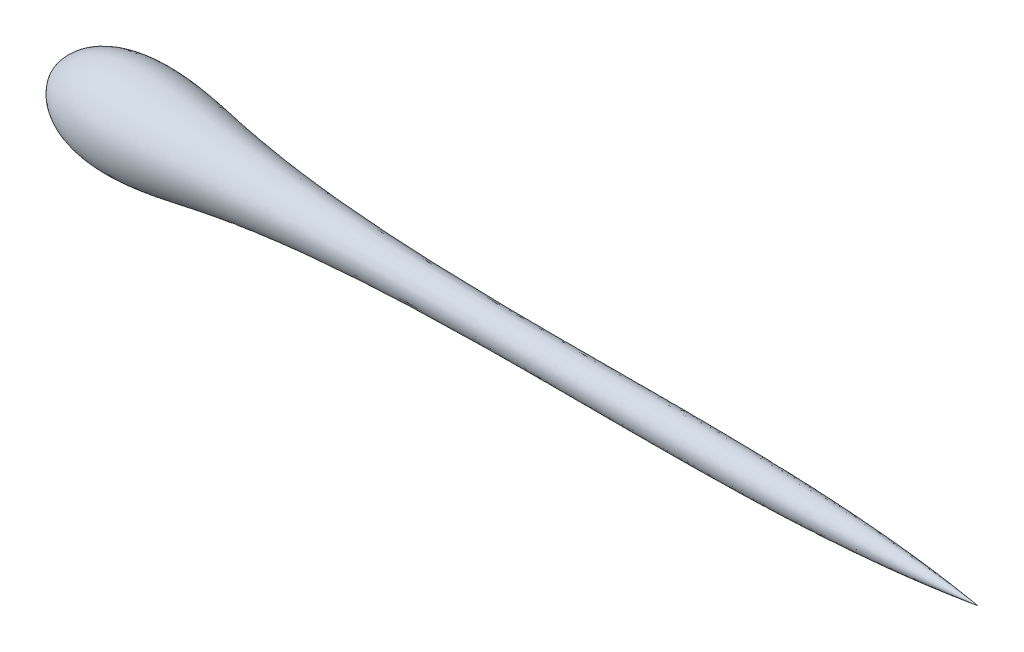
ISO-10303-21;
HEADER;
FILE_DESCRIPTION(('STEP AP214'),'2;1');
FILE_NAME('part.step','',(''),(''),'','','');
FILE_SCHEMA(('AUTOMOTIVE_DESIGN { 1 0 10303 214 1 1 1 1 }'));
ENDSEC;
DATA;
#1=APPLICATION_CONTEXT('core data for automotive mechanical design processes');
#2=APPLICATION_PROTOCOL_DEFINITION('international standard','automotive_design',2000,#1);
#3=PRODUCT_CONTEXT('',#1,'mechanical');
#4=PRODUCT('Part','Part','',(#3));
#5=PRODUCT_RELATED_PRODUCT_CATEGORY('part','',(#4));
#6=PRODUCT_DEFINITION_FORMATION('','',#4);
#7=PRODUCT_DEFINITION_CONTEXT('part definition',#1,'design');
#8=PRODUCT_DEFINITION('design','',#6,#7);
#9=PRODUCT_DEFINITION_SHAPE('','',#8);
#10=(LENGTH_UNIT() NAMED_UNIT(*) SI_UNIT(.MILLI.,.METRE.));
#11=(NAMED_UNIT(*) PLANE_ANGLE_UNIT() SI_UNIT($,.RADIAN.));
#12=(NAMED_UNIT(*) SI_UNIT($,.STERADIAN.) SOLID_ANGLE_UNIT());
#13=UNCERTAINTY_MEASURE_WITH_UNIT(LENGTH_MEASURE(1.E-05),#10,'distance_accuracy_value','');
#14=(GEOMETRIC_REPRESENTATION_CONTEXT(3) GLOBAL_UNCERTAINTY_ASSIGNED_CONTEXT((#13)) GLOBAL_UNIT_ASSIGNED_CONTEXT((#10,
#11,#12)) REPRESENTATION_CONTEXT('',''));
#15=CARTESIAN_POINT('',(0.,0.,0.));
#16=DIRECTION('',(0.,0.,1.));
#17=DIRECTION('',(1.,0.,0.));
#18=AXIS2_PLACEMENT_3D('',#15,#16,#17);
#19=CARTESIAN_POINT('',(1000.,0.,0.));
#20=CARTESIAN_POINT('',(903.034041004491,12.9499980085464,0.));
#21=CARTESIAN_POINT('',(735.371820765357,18.631157633375,0.));
#22=CARTESIAN_POINT('',(515.962890224562,16.5214128525989,0.));
#23=CARTESIAN_POINT('',(338.15688900976,19.4118449859331,0.));
#24=CARTESIAN_POINT('',(203.1145967926,30.80967755671,0.));
#25=CARTESIAN_POINT('',(87.3348327650906,54.2644760888776,0.));
#26=CARTESIAN_POINT('',(13.0489363199446,40.9648755212386,0.));
#27=CARTESIAN_POINT('',(0.,0.,0.));
#28=B_SPLINE_CURVE_WITH_KNOTS('',3,(#19,#20,#21,#22,#23,#24,#25,#26,#27),.UNSPECIFIED.,.F.,.F.,
(4,1,1,1,1,1,4),(0.,0.287250836583417,0.493308266522196,0.645067322668113,0.811609625071967,
0.88742824296598,1.),.UNSPECIFIED.);
#29=CARTESIAN_POINT('',(0.,0.,0.));
#30=DIRECTION('',(-1.,0.,0.));
#31=AXIS1_PLACEMENT('',#29,#30);
#32=SURFACE_OF_REVOLUTION('',#28,#31);
#33=CARTESIAN_POINT('',(0.,0.,0.));
#34=VERTEX_POINT('',#33);
#35=VERTEX_LOOP('',#34);
#36=FACE_BOUND('',#35,.T.);
#37=CARTESIAN_POINT('',(1000.,0.,0.));
#38=VERTEX_POINT('',#37);
#39=VERTEX_LOOP('',#38);
#40=FACE_BOUND('',#39,.T.);
#41=ADVANCED_FACE('F36',(#36,#40),#32,.T.);
#42=CLOSED_SHELL('',(#41));
#43=MANIFOLD_SOLID_BREP('B2',#42);
#44=ADVANCED_BREP_SHAPE_REPRESENTATION('',(#18,#43),#14);
#45=SHAPE_DEFINITION_REPRESENTATION(#9,#44);
ENDSEC;
END-ISO-10303-21;
